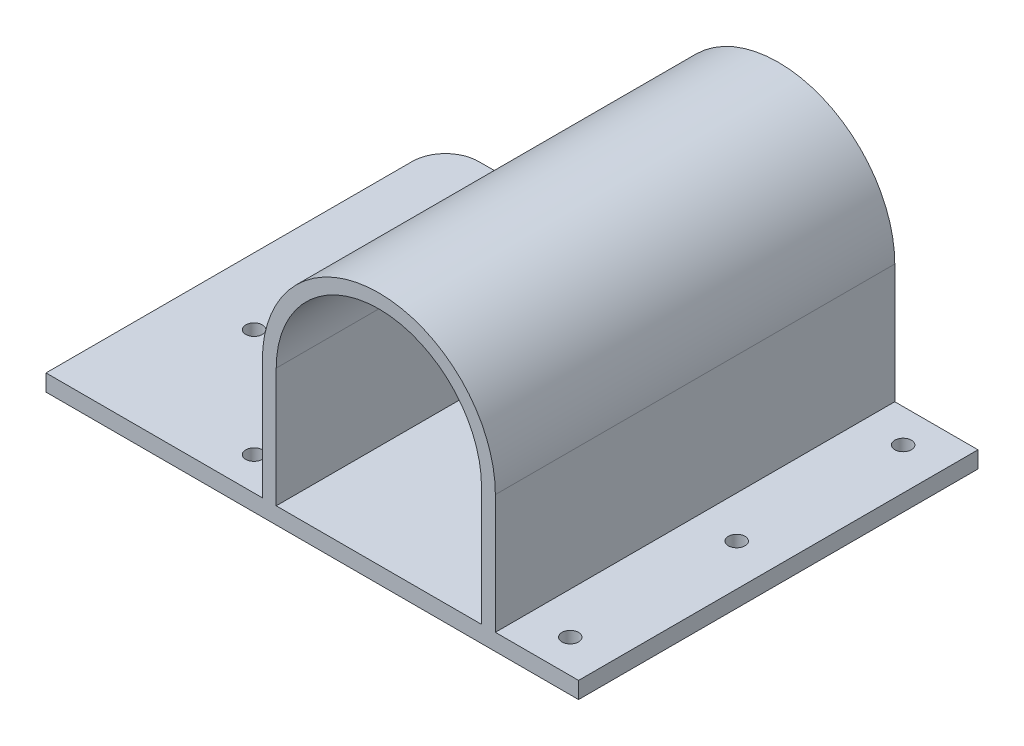
ISO-10303-21;
HEADER;
FILE_DESCRIPTION(('STEP AP214'),'2;1');
FILE_NAME('part.step','',(''),(''),'','','');
FILE_SCHEMA(('AUTOMOTIVE_DESIGN { 1 0 10303 214 1 1 1 1 }'));
ENDSEC;
DATA;
#1=APPLICATION_CONTEXT('core data for automotive mechanical design processes');
#2=APPLICATION_PROTOCOL_DEFINITION('international standard','automotive_design',2000,#1);
#3=PRODUCT_CONTEXT('',#1,'mechanical');
#4=PRODUCT('Part','Part','',(#3));
#5=PRODUCT_RELATED_PRODUCT_CATEGORY('part','',(#4));
#6=PRODUCT_DEFINITION_FORMATION('','',#4);
#7=PRODUCT_DEFINITION_CONTEXT('part definition',#1,'design');
#8=PRODUCT_DEFINITION('design','',#6,#7);
#9=PRODUCT_DEFINITION_SHAPE('','',#8);
#10=(LENGTH_UNIT() NAMED_UNIT(*) SI_UNIT(.MILLI.,.METRE.));
#11=(NAMED_UNIT(*) PLANE_ANGLE_UNIT() SI_UNIT($,.RADIAN.));
#12=(NAMED_UNIT(*) SI_UNIT($,.STERADIAN.) SOLID_ANGLE_UNIT());
#13=UNCERTAINTY_MEASURE_WITH_UNIT(LENGTH_MEASURE(1.E-05),#10,'distance_accuracy_value','');
#14=(GEOMETRIC_REPRESENTATION_CONTEXT(3) GLOBAL_UNCERTAINTY_ASSIGNED_CONTEXT((#13)) GLOBAL_UNIT_ASSIGNED_CONTEXT((#10,
#11,#12)) REPRESENTATION_CONTEXT('',''));
#15=CARTESIAN_POINT('',(0.,0.,0.));
#16=DIRECTION('',(0.,0.,1.));
#17=DIRECTION('',(1.,0.,0.));
#18=AXIS2_PLACEMENT_3D('',#15,#16,#17);
#19=CARTESIAN_POINT('',(0.,-15.5,72.));
#20=DIRECTION('',(0.,0.,-1.));
#21=DIRECTION('',(-1.,0.,0.));
#22=AXIS2_PLACEMENT_3D('',#19,#20,#21);
#23=CYLINDRICAL_SURFACE('',#22,1.65);
#24=CARTESIAN_POINT('',(0.,-15.5,0.));
#25=DIRECTION('',(0.,0.,1.));
#26=DIRECTION('',(1.,0.,0.));
#27=AXIS2_PLACEMENT_3D('',#24,#25,#26);
#28=CIRCLE('',#27,1.65);
#29=CARTESIAN_POINT('',(1.65000000000006,-15.5,0.));
#30=VERTEX_POINT('',#29);
#31=EDGE_CURVE('E262',#30,#30,#28,.T.);
#32=ORIENTED_EDGE('',*,*,#31,.F.);
#33=EDGE_LOOP('',(#32));
#34=FACE_BOUND('',#33,.T.);
#35=CARTESIAN_POINT('',(0.,-15.5,15.));
#36=DIRECTION('',(0.,0.,1.));
#37=DIRECTION('',(1.,0.,0.));
#38=AXIS2_PLACEMENT_3D('',#35,#36,#37);
#39=CIRCLE('',#38,1.65);
#40=CARTESIAN_POINT('',(1.65000000000006,-15.5,15.));
#41=VERTEX_POINT('',#40);
#42=EDGE_CURVE('E241',#41,#41,#39,.T.);
#43=ORIENTED_EDGE('',*,*,#42,.T.);
#44=EDGE_LOOP('',(#43));
#45=FACE_BOUND('',#44,.T.);
#46=ADVANCED_FACE('F39',(#34,#45),#23,.F.);
#47=CARTESIAN_POINT('',(-7.,0.,72.));
#48=DIRECTION('',(0.,0.,-1.));
#49=DIRECTION('',(-1.,0.,0.));
#50=AXIS2_PLACEMENT_3D('',#47,#48,#49);
#51=CYLINDRICAL_SURFACE('',#50,6.15);
#52=CARTESIAN_POINT('',(-7.,0.,0.));
#53=DIRECTION('',(0.,0.,1.));
#54=DIRECTION('',(1.,0.,0.));
#55=AXIS2_PLACEMENT_3D('',#52,#53,#54);
#56=CIRCLE('',#55,6.15);
#57=CARTESIAN_POINT('',(-0.85,0.,0.));
#58=VERTEX_POINT('',#57);
#59=EDGE_CURVE('E259',#58,#58,#56,.T.);
#60=ORIENTED_EDGE('',*,*,#59,.F.);
#61=EDGE_LOOP('',(#60));
#62=FACE_BOUND('',#61,.T.);
#63=CARTESIAN_POINT('',(-7.,0.,15.));
#64=DIRECTION('',(0.,0.,1.));
#65=DIRECTION('',(1.,0.,0.));
#66=AXIS2_PLACEMENT_3D('',#63,#64,#65);
#67=CIRCLE('',#66,6.15);
#68=CARTESIAN_POINT('',(-0.85,0.,15.));
#69=VERTEX_POINT('',#68);
#70=EDGE_CURVE('E238',#69,#69,#67,.T.);
#71=ORIENTED_EDGE('',*,*,#70,.T.);
#72=EDGE_LOOP('',(#71));
#73=FACE_BOUND('',#72,.T.);
#74=ADVANCED_FACE('F355',(#62,#73),#51,.F.);
#75=CARTESIAN_POINT('',(-13.4233937586588,-7.75000000000005,72.));
#76=DIRECTION('',(0.,0.,-1.));
#77=DIRECTION('',(-1.,0.,0.));
#78=AXIS2_PLACEMENT_3D('',#75,#76,#77);
#79=CYLINDRICAL_SURFACE('',#78,1.65);
#80=CARTESIAN_POINT('',(-13.4233937586588,-7.75000000000005,0.));
#81=DIRECTION('',(0.,0.,1.));
#82=DIRECTION('',(1.,0.,0.));
#83=AXIS2_PLACEMENT_3D('',#80,#81,#82);
#84=CIRCLE('',#83,1.65);
#85=CARTESIAN_POINT('',(-11.7733937586588,-7.75000000000005,0.));
#86=VERTEX_POINT('',#85);
#87=EDGE_CURVE('E256',#86,#86,#84,.T.);
#88=ORIENTED_EDGE('',*,*,#87,.F.);
#89=EDGE_LOOP('',(#88));
#90=FACE_BOUND('',#89,.T.);
#91=CARTESIAN_POINT('',(-13.4233937586588,-7.75000000000005,15.));
#92=DIRECTION('',(0.,0.,1.));
#93=DIRECTION('',(1.,0.,0.));
#94=AXIS2_PLACEMENT_3D('',#91,#92,#93);
#95=CIRCLE('',#94,1.65);
#96=CARTESIAN_POINT('',(-11.7733937586588,-7.75000000000005,15.));
#97=VERTEX_POINT('',#96);
#98=EDGE_CURVE('E235',#97,#97,#95,.T.);
#99=ORIENTED_EDGE('',*,*,#98,.T.);
#100=EDGE_LOOP('',(#99));
#101=FACE_BOUND('',#100,.T.);
#102=ADVANCED_FACE('F361',(#90,#101),#79,.F.);
#103=CARTESIAN_POINT('',(-13.4233937586588,7.74999999999994,72.));
#104=DIRECTION('',(0.,0.,-1.));
#105=DIRECTION('',(-1.,0.,0.));
#106=AXIS2_PLACEMENT_3D('',#103,#104,#105);
#107=CYLINDRICAL_SURFACE('',#106,1.65);
#108=CARTESIAN_POINT('',(-13.4233937586588,7.74999999999994,0.));
#109=DIRECTION('',(0.,0.,1.));
#110=DIRECTION('',(1.,0.,0.));
#111=AXIS2_PLACEMENT_3D('',#108,#109,#110);
#112=CIRCLE('',#111,1.65);
#113=CARTESIAN_POINT('',(-11.7733937586588,7.74999999999994,0.));
#114=VERTEX_POINT('',#113);
#115=EDGE_CURVE('E253',#114,#114,#112,.T.);
#116=ORIENTED_EDGE('',*,*,#115,.F.);
#117=EDGE_LOOP('',(#116));
#118=FACE_BOUND('',#117,.T.);
#119=CARTESIAN_POINT('',(-13.4233937586588,7.74999999999994,15.));
#120=DIRECTION('',(0.,0.,1.));
#121=DIRECTION('',(1.,0.,0.));
#122=AXIS2_PLACEMENT_3D('',#119,#120,#121);
#123=CIRCLE('',#122,1.65);
#124=CARTESIAN_POINT('',(-11.7733937586588,7.74999999999994,15.));
#125=VERTEX_POINT('',#124);
#126=EDGE_CURVE('E232',#125,#125,#123,.T.);
#127=ORIENTED_EDGE('',*,*,#126,.T.);
#128=EDGE_LOOP('',(#127));
#129=FACE_BOUND('',#128,.T.);
#130=ADVANCED_FACE('F401',(#118,#129),#107,.F.);
#131=CARTESIAN_POINT('',(0.,15.5,72.));
#132=DIRECTION('',(0.,0.,-1.));
#133=DIRECTION('',(-1.,0.,0.));
#134=AXIS2_PLACEMENT_3D('',#131,#132,#133);
#135=CYLINDRICAL_SURFACE('',#134,1.65);
#136=CARTESIAN_POINT('',(0.,15.5,0.));
#137=DIRECTION('',(0.,0.,1.));
#138=DIRECTION('',(1.,0.,0.));
#139=AXIS2_PLACEMENT_3D('',#136,#137,#138);
#140=CIRCLE('',#139,1.65);
#141=CARTESIAN_POINT('',(1.64999999999994,15.5,0.));
#142=VERTEX_POINT('',#141);
#143=EDGE_CURVE('E250',#142,#142,#140,.T.);
#144=ORIENTED_EDGE('',*,*,#143,.F.);
#145=EDGE_LOOP('',(#144));
#146=FACE_BOUND('',#145,.T.);
#147=CARTESIAN_POINT('',(0.,15.5,15.));
#148=DIRECTION('',(0.,0.,1.));
#149=DIRECTION('',(1.,0.,0.));
#150=AXIS2_PLACEMENT_3D('',#147,#148,#149);
#151=CIRCLE('',#150,1.65);
#152=CARTESIAN_POINT('',(1.64999999999994,15.5,15.));
#153=VERTEX_POINT('',#152);
#154=EDGE_CURVE('E229',#153,#153,#151,.T.);
#155=ORIENTED_EDGE('',*,*,#154,.T.);
#156=EDGE_LOOP('',(#155));
#157=FACE_BOUND('',#156,.T.);
#158=ADVANCED_FACE('F397',(#146,#157),#135,.F.);
#159=CARTESIAN_POINT('',(13.4233937586588,7.75000000000006,72.));
#160=DIRECTION('',(0.,0.,-1.));
#161=DIRECTION('',(-1.,0.,0.));
#162=AXIS2_PLACEMENT_3D('',#159,#160,#161);
#163=CYLINDRICAL_SURFACE('',#162,1.65);
#164=CARTESIAN_POINT('',(13.4233937586588,7.75000000000006,0.));
#165=DIRECTION('',(0.,0.,1.));
#166=DIRECTION('',(1.,0.,0.));
#167=AXIS2_PLACEMENT_3D('',#164,#165,#166);
#168=CIRCLE('',#167,1.65);
#169=CARTESIAN_POINT('',(15.0733937586588,7.75000000000006,0.));
#170=VERTEX_POINT('',#169);
#171=EDGE_CURVE('E247',#170,#170,#168,.T.);
#172=ORIENTED_EDGE('',*,*,#171,.F.);
#173=EDGE_LOOP('',(#172));
#174=FACE_BOUND('',#173,.T.);
#175=CARTESIAN_POINT('',(13.4233937586588,7.75000000000006,15.));
#176=DIRECTION('',(0.,0.,1.));
#177=DIRECTION('',(1.,0.,0.));
#178=AXIS2_PLACEMENT_3D('',#175,#176,#177);
#179=CIRCLE('',#178,1.65);
#180=CARTESIAN_POINT('',(15.0733937586588,7.75000000000006,15.));
#181=VERTEX_POINT('',#180);
#182=EDGE_CURVE('E226',#181,#181,#179,.T.);
#183=ORIENTED_EDGE('',*,*,#182,.T.);
#184=EDGE_LOOP('',(#183));
#185=FACE_BOUND('',#184,.T.);
#186=ADVANCED_FACE('F393',(#174,#185),#163,.F.);
#187=CARTESIAN_POINT('',(13.4233937586588,-7.74999999999995,72.));
#188=DIRECTION('',(0.,0.,-1.));
#189=DIRECTION('',(-1.,0.,0.));
#190=AXIS2_PLACEMENT_3D('',#187,#188,#189);
#191=CYLINDRICAL_SURFACE('',#190,1.65);
#192=CARTESIAN_POINT('',(13.4233937586588,-7.74999999999995,0.));
#193=DIRECTION('',(0.,0.,1.));
#194=DIRECTION('',(1.,0.,0.));
#195=AXIS2_PLACEMENT_3D('',#192,#193,#194);
#196=CIRCLE('',#195,1.65);
#197=CARTESIAN_POINT('',(15.0733937586588,-7.74999999999995,0.));
#198=VERTEX_POINT('',#197);
#199=EDGE_CURVE('E244',#198,#198,#196,.T.);
#200=ORIENTED_EDGE('',*,*,#199,.F.);
#201=EDGE_LOOP('',(#200));
#202=FACE_BOUND('',#201,.T.);
#203=CARTESIAN_POINT('',(13.4233937586588,-7.74999999999995,15.));
#204=DIRECTION('',(0.,0.,1.));
#205=DIRECTION('',(1.,0.,0.));
#206=AXIS2_PLACEMENT_3D('',#203,#204,#205);
#207=CIRCLE('',#206,1.65);
#208=CARTESIAN_POINT('',(15.0733937586588,-7.74999999999995,15.));
#209=VERTEX_POINT('',#208);
#210=EDGE_CURVE('E219',#209,#209,#207,.T.);
#211=ORIENTED_EDGE('',*,*,#210,.T.);
#212=EDGE_LOOP('',(#211));
#213=FACE_BOUND('',#212,.T.);
#214=ADVANCED_FACE('F370',(#202,#213),#191,.F.);
#215=CARTESIAN_POINT('',(0.,0.,72.));
#216=DIRECTION('',(0.,0.,1.));
#217=DIRECTION('',(1.,0.,0.));
#218=AXIS2_PLACEMENT_3D('',#215,#216,#217);
#219=PLANE('',#218);
#220=CARTESIAN_POINT('',(0.,0.,72.));
#221=DIRECTION('',(0.,0.,1.));
#222=DIRECTION('',(1.,0.,0.));
#223=AXIS2_PLACEMENT_3D('',#220,#221,#222);
#224=CIRCLE('',#223,18.5);
#225=CARTESIAN_POINT('',(18.5,0.,72.));
#226=VERTEX_POINT('',#225);
#227=CARTESIAN_POINT('',(-18.5,0.,72.));
#228=VERTEX_POINT('',#227);
#229=EDGE_CURVE('E191',#226,#228,#224,.T.);
#230=ORIENTED_EDGE('',*,*,#229,.F.);
#231=DIRECTION('',(0.,1.,0.));
#232=VECTOR('',#231,1.);
#233=CARTESIAN_POINT('',(18.5,-21.5,72.));
#234=LINE('',#233,#232);
#235=CARTESIAN_POINT('',(18.5,-21.5,72.));
#236=VERTEX_POINT('',#235);
#237=EDGE_CURVE('E198',#236,#226,#234,.T.);
#238=ORIENTED_EDGE('',*,*,#237,.F.);
#239=DIRECTION('',(1.,0.,0.));
#240=VECTOR('',#239,1.);
#241=CARTESIAN_POINT('',(-18.5,-21.5,72.));
#242=LINE('',#241,#240);
#243=CARTESIAN_POINT('',(-18.5,-21.5,72.));
#244=VERTEX_POINT('',#243);
#245=EDGE_CURVE('E212',#244,#236,#242,.T.);
#246=ORIENTED_EDGE('',*,*,#245,.F.);
#247=DIRECTION('',(0.,-1.,0.));
#248=VECTOR('',#247,1.);
#249=CARTESIAN_POINT('',(-18.5,0.,72.));
#250=LINE('',#249,#248);
#251=EDGE_CURVE('E209',#228,#244,#250,.T.);
#252=ORIENTED_EDGE('',*,*,#251,.F.);
#253=EDGE_LOOP('',(#230,#238,#246,#252));
#254=FACE_BOUND('',#253,.T.);
#255=CARTESIAN_POINT('',(0.,0.,72.));
#256=DIRECTION('',(0.,0.,1.));
#257=DIRECTION('',(1.,0.,0.));
#258=AXIS2_PLACEMENT_3D('',#255,#256,#257);
#259=CIRCLE('',#258,21.);
#260=CARTESIAN_POINT('',(21.,0.,72.));
#261=VERTEX_POINT('',#260);
#262=CARTESIAN_POINT('',(-21.,0.,72.));
#263=VERTEX_POINT('',#262);
#264=EDGE_CURVE('E266',#261,#263,#259,.T.);
#265=ORIENTED_EDGE('',*,*,#264,.T.);
#266=DIRECTION('',(0.,-1.,0.));
#267=VECTOR('',#266,1.);
#268=CARTESIAN_POINT('',(-21.,0.,72.));
#269=LINE('',#268,#267);
#270=CARTESIAN_POINT('',(-21.,-21.5,72.));
#271=VERTEX_POINT('',#270);
#272=EDGE_CURVE('E268',#263,#271,#269,.T.);
#273=ORIENTED_EDGE('',*,*,#272,.T.);
#274=DIRECTION('',(-1.,0.,0.));
#275=VECTOR('',#274,1.);
#276=CARTESIAN_POINT('',(-21.,-21.5,72.));
#277=LINE('',#276,#275);
#278=CARTESIAN_POINT('',(-60.,-21.5,72.));
#279=VERTEX_POINT('',#278);
#280=EDGE_CURVE('E148',#271,#279,#277,.T.);
#281=ORIENTED_EDGE('',*,*,#280,.T.);
#282=DIRECTION('',(0.,1.,0.));
#283=VECTOR('',#282,1.);
#284=CARTESIAN_POINT('',(-60.,-24.5,72.));
#285=LINE('',#284,#283);
#286=CARTESIAN_POINT('',(-60.,-24.5,72.));
#287=VERTEX_POINT('',#286);
#288=EDGE_CURVE('E134',#287,#279,#285,.T.);
#289=ORIENTED_EDGE('',*,*,#288,.F.);
#290=DIRECTION('',(1.,0.,0.));
#291=VECTOR('',#290,1.);
#292=CARTESIAN_POINT('',(-36.,-24.5,72.));
#293=LINE('',#292,#291);
#294=CARTESIAN_POINT('',(36.,-24.5,72.));
#295=VERTEX_POINT('',#294);
#296=EDGE_CURVE('E140',#287,#295,#293,.T.);
#297=ORIENTED_EDGE('',*,*,#296,.T.);
#298=DIRECTION('',(0.,1.,0.));
#299=VECTOR('',#298,1.);
#300=CARTESIAN_POINT('',(36.,-24.5,72.));
#301=LINE('',#300,#299);
#302=CARTESIAN_POINT('',(36.,-21.5,72.));
#303=VERTEX_POINT('',#302);
#304=EDGE_CURVE('E147',#295,#303,#301,.T.);
#305=ORIENTED_EDGE('',*,*,#304,.T.);
#306=DIRECTION('',(-1.,0.,0.));
#307=VECTOR('',#306,1.);
#308=CARTESIAN_POINT('',(36.,-21.5,72.));
#309=LINE('',#308,#307);
#310=CARTESIAN_POINT('',(21.,-21.5,72.));
#311=VERTEX_POINT('',#310);
#312=EDGE_CURVE('E273',#303,#311,#309,.T.);
#313=ORIENTED_EDGE('',*,*,#312,.T.);
#314=DIRECTION('',(0.,1.,0.));
#315=VECTOR('',#314,1.);
#316=CARTESIAN_POINT('',(21.,-21.5,72.));
#317=LINE('',#316,#315);
#318=EDGE_CURVE('E275',#311,#261,#317,.T.);
#319=ORIENTED_EDGE('',*,*,#318,.T.);
#320=EDGE_LOOP('',(#265,#273,#281,#289,#297,#305,#313,#319));
#321=FACE_BOUND('',#320,.T.);
#322=ADVANCED_FACE('F152',(#254,#321),#219,.T.);
#323=CARTESIAN_POINT('',(0.,0.,0.));
#324=DIRECTION('',(0.,0.,1.));
#325=DIRECTION('',(1.,0.,0.));
#326=AXIS2_PLACEMENT_3D('',#323,#324,#325);
#327=PLANE('',#326);
#328=DIRECTION('',(1.,0.,0.));
#329=VECTOR('',#328,1.);
#330=CARTESIAN_POINT('',(-36.,-24.5,0.));
#331=LINE('',#330,#329);
#332=CARTESIAN_POINT('',(-54.,-24.5,0.));
#333=VERTEX_POINT('',#332);
#334=CARTESIAN_POINT('',(36.,-24.5,0.));
#335=VERTEX_POINT('',#334);
#336=EDGE_CURVE('E284',#333,#335,#331,.T.);
#337=ORIENTED_EDGE('',*,*,#336,.F.);
#338=DIRECTION('',(0.,1.,0.));
#339=VECTOR('',#338,1.);
#340=CARTESIAN_POINT('',(-54.,-21.5,0.));
#341=LINE('',#340,#339);
#342=CARTESIAN_POINT('',(-54.,-21.5,0.));
#343=VERTEX_POINT('',#342);
#344=EDGE_CURVE('E306',#333,#343,#341,.T.);
#345=ORIENTED_EDGE('',*,*,#344,.T.);
#346=DIRECTION('',(-1.,0.,0.));
#347=VECTOR('',#346,1.);
#348=CARTESIAN_POINT('',(-21.,-21.5,0.));
#349=LINE('',#348,#347);
#350=CARTESIAN_POINT('',(-21.,-21.5,0.));
#351=VERTEX_POINT('',#350);
#352=EDGE_CURVE('E282',#351,#343,#349,.T.);
#353=ORIENTED_EDGE('',*,*,#352,.F.);
#354=DIRECTION('',(0.,-1.,0.));
#355=VECTOR('',#354,1.);
#356=CARTESIAN_POINT('',(-21.,0.,0.));
#357=LINE('',#356,#355);
#358=CARTESIAN_POINT('',(-21.,0.,0.));
#359=VERTEX_POINT('',#358);
#360=EDGE_CURVE('E280',#359,#351,#357,.T.);
#361=ORIENTED_EDGE('',*,*,#360,.F.);
#362=CARTESIAN_POINT('',(0.,0.,0.));
#363=DIRECTION('',(0.,0.,1.));
#364=DIRECTION('',(1.,0.,0.));
#365=AXIS2_PLACEMENT_3D('',#362,#363,#364);
#366=CIRCLE('',#365,21.);
#367=CARTESIAN_POINT('',(21.,0.,0.));
#368=VERTEX_POINT('',#367);
#369=EDGE_CURVE('E265',#368,#359,#366,.T.);
#370=ORIENTED_EDGE('',*,*,#369,.F.);
#371=DIRECTION('',(0.,1.,0.));
#372=VECTOR('',#371,1.);
#373=CARTESIAN_POINT('',(21.,-21.5,0.));
#374=LINE('',#373,#372);
#375=CARTESIAN_POINT('',(21.,-21.5,0.));
#376=VERTEX_POINT('',#375);
#377=EDGE_CURVE('E269',#376,#368,#374,.T.);
#378=ORIENTED_EDGE('',*,*,#377,.F.);
#379=DIRECTION('',(-1.,0.,0.));
#380=VECTOR('',#379,1.);
#381=CARTESIAN_POINT('',(36.,-21.5,0.));
#382=LINE('',#381,#380);
#383=CARTESIAN_POINT('',(36.,-21.5,0.));
#384=VERTEX_POINT('',#383);
#385=EDGE_CURVE('E288',#384,#376,#382,.T.);
#386=ORIENTED_EDGE('',*,*,#385,.F.);
#387=DIRECTION('',(0.,1.,0.));
#388=VECTOR('',#387,1.);
#389=CARTESIAN_POINT('',(36.,-24.5,0.));
#390=LINE('',#389,#388);
#391=EDGE_CURVE('E286',#335,#384,#390,.T.);
#392=ORIENTED_EDGE('',*,*,#391,.F.);
#393=EDGE_LOOP('',(#337,#345,#353,#361,#370,#378,#386,#392));
#394=FACE_BOUND('',#393,.T.);
#395=ORIENTED_EDGE('',*,*,#31,.T.);
#396=EDGE_LOOP('',(#395));
#397=FACE_BOUND('',#396,.T.);
#398=ORIENTED_EDGE('',*,*,#59,.T.);
#399=EDGE_LOOP('',(#398));
#400=FACE_BOUND('',#399,.T.);
#401=ORIENTED_EDGE('',*,*,#87,.T.);
#402=EDGE_LOOP('',(#401));
#403=FACE_BOUND('',#402,.T.);
#404=ORIENTED_EDGE('',*,*,#115,.T.);
#405=EDGE_LOOP('',(#404));
#406=FACE_BOUND('',#405,.T.);
#407=ORIENTED_EDGE('',*,*,#143,.T.);
#408=EDGE_LOOP('',(#407));
#409=FACE_BOUND('',#408,.T.);
#410=ORIENTED_EDGE('',*,*,#171,.T.);
#411=EDGE_LOOP('',(#410));
#412=FACE_BOUND('',#411,.T.);
#413=ORIENTED_EDGE('',*,*,#199,.T.);
#414=EDGE_LOOP('',(#413));
#415=FACE_BOUND('',#414,.T.);
#416=ADVANCED_FACE('F315',(#394,#397,#400,#403,#406,#409,#412,#415),#327,.F.);
#417=CARTESIAN_POINT('',(0.,0.,72.));
#418=DIRECTION('',(0.,0.,-1.));
#419=DIRECTION('',(-1.,0.,0.));
#420=AXIS2_PLACEMENT_3D('',#417,#418,#419);
#421=CYLINDRICAL_SURFACE('',#420,21.);
#422=ORIENTED_EDGE('',*,*,#369,.T.);
#423=DIRECTION('',(0.,0.,-1.));
#424=VECTOR('',#423,1.);
#425=CARTESIAN_POINT('',(-21.,0.,72.));
#426=LINE('',#425,#424);
#427=EDGE_CURVE('E303',#263,#359,#426,.T.);
#428=ORIENTED_EDGE('',*,*,#427,.F.);
#429=ORIENTED_EDGE('',*,*,#264,.F.);
#430=DIRECTION('',(0.,0.,-1.));
#431=VECTOR('',#430,1.);
#432=CARTESIAN_POINT('',(21.,0.,72.));
#433=LINE('',#432,#431);
#434=EDGE_CURVE('E277',#261,#368,#433,.T.);
#435=ORIENTED_EDGE('',*,*,#434,.T.);
#436=EDGE_LOOP('',(#422,#428,#429,#435));
#437=FACE_BOUND('',#436,.T.);
#438=ADVANCED_FACE('F329',(#437),#421,.T.);
#439=CARTESIAN_POINT('',(-21.,0.,72.));
#440=DIRECTION('',(1.,0.,0.));
#441=DIRECTION('',(0.,1.,0.));
#442=AXIS2_PLACEMENT_3D('',#439,#440,#441);
#443=PLANE('',#442);
#444=ORIENTED_EDGE('',*,*,#360,.T.);
#445=DIRECTION('',(0.,0.,-1.));
#446=VECTOR('',#445,1.);
#447=CARTESIAN_POINT('',(-21.,-21.5,72.));
#448=LINE('',#447,#446);
#449=EDGE_CURVE('E300',#271,#351,#448,.T.);
#450=ORIENTED_EDGE('',*,*,#449,.F.);
#451=ORIENTED_EDGE('',*,*,#272,.F.);
#452=ORIENTED_EDGE('',*,*,#427,.T.);
#453=EDGE_LOOP('',(#444,#450,#451,#452));
#454=FACE_BOUND('',#453,.T.);
#455=ADVANCED_FACE('F323',(#454),#443,.F.);
#456=CARTESIAN_POINT('',(-21.,-21.5,72.));
#457=DIRECTION('',(0.,-1.,0.));
#458=DIRECTION('',(0.,0.,-1.));
#459=AXIS2_PLACEMENT_3D('',#456,#457,#458);
#460=PLANE('',#459);
#461=CARTESIAN_POINT('',(-28.5,-21.5,6.));
#462=DIRECTION('',(0.,1.,0.));
#463=DIRECTION('',(0.,0.,1.));
#464=AXIS2_PLACEMENT_3D('',#461,#462,#463);
#465=CIRCLE('',#464,1.5);
#466=CARTESIAN_POINT('',(-28.5,-21.5,7.5));
#467=VERTEX_POINT('',#466);
#468=EDGE_CURVE('E164',#467,#467,#465,.T.);
#469=ORIENTED_EDGE('',*,*,#468,.F.);
#470=EDGE_LOOP('',(#469));
#471=FACE_BOUND('',#470,.T.);
#472=CARTESIAN_POINT('',(-28.5,-21.5,66.));
#473=DIRECTION('',(0.,1.,0.));
#474=DIRECTION('',(0.,0.,1.));
#475=AXIS2_PLACEMENT_3D('',#472,#473,#474);
#476=CIRCLE('',#475,1.5);
#477=CARTESIAN_POINT('',(-28.5,-21.5,67.5));
#478=VERTEX_POINT('',#477);
#479=EDGE_CURVE('E171',#478,#478,#476,.T.);
#480=ORIENTED_EDGE('',*,*,#479,.F.);
#481=EDGE_LOOP('',(#480));
#482=FACE_BOUND('',#481,.T.);
#483=CARTESIAN_POINT('',(-28.5,-21.5,36.));
#484=DIRECTION('',(0.,1.,0.));
#485=DIRECTION('',(0.,0.,1.));
#486=AXIS2_PLACEMENT_3D('',#483,#484,#485);
#487=CIRCLE('',#486,1.5);
#488=CARTESIAN_POINT('',(-28.5,-21.5,37.5));
#489=VERTEX_POINT('',#488);
#490=EDGE_CURVE('E167',#489,#489,#487,.T.);
#491=ORIENTED_EDGE('',*,*,#490,.F.);
#492=EDGE_LOOP('',(#491));
#493=FACE_BOUND('',#492,.T.);
#494=ORIENTED_EDGE('',*,*,#352,.T.);
#495=CARTESIAN_POINT('',(-54.,-21.5,6.));
#496=DIRECTION('',(0.,-1.,0.));
#497=DIRECTION('',(0.,0.,-1.));
#498=AXIS2_PLACEMENT_3D('',#495,#496,#497);
#499=CIRCLE('',#498,6.);
#500=CARTESIAN_POINT('',(-60.,-21.5,6.00000000000001));
#501=VERTEX_POINT('',#500);
#502=EDGE_CURVE('E61',#343,#501,#499,.F.);
#503=ORIENTED_EDGE('',*,*,#502,.T.);
#504=DIRECTION('',(0.,0.,1.));
#505=VECTOR('',#504,1.);
#506=CARTESIAN_POINT('',(-60.,-21.5,72.));
#507=LINE('',#506,#505);
#508=EDGE_CURVE('E137',#501,#279,#507,.T.);
#509=ORIENTED_EDGE('',*,*,#508,.T.);
#510=ORIENTED_EDGE('',*,*,#280,.F.);
#511=ORIENTED_EDGE('',*,*,#449,.T.);
#512=EDGE_LOOP('',(#494,#503,#509,#510,#511));
#513=FACE_BOUND('',#512,.T.);
#514=CARTESIAN_POINT('',(-48.,-21.5,10.5));
#515=DIRECTION('',(0.,1.,0.));
#516=DIRECTION('',(0.,0.,1.));
#517=AXIS2_PLACEMENT_3D('',#514,#515,#516);
#518=CIRCLE('',#517,1.5);
#519=CARTESIAN_POINT('',(-48.,-21.5,12.));
#520=VERTEX_POINT('',#519);
#521=EDGE_CURVE('E483',#520,#520,#518,.T.);
#522=ORIENTED_EDGE('',*,*,#521,.F.);
#523=EDGE_LOOP('',(#522));
#524=FACE_BOUND('',#523,.T.);
#525=CARTESIAN_POINT('',(-48.,-21.5,46.5));
#526=DIRECTION('',(0.,1.,0.));
#527=DIRECTION('',(0.,0.,1.));
#528=AXIS2_PLACEMENT_3D('',#525,#526,#527);
#529=CIRCLE('',#528,1.5);
#530=CARTESIAN_POINT('',(-48.,-21.5,48.));
#531=VERTEX_POINT('',#530);
#532=EDGE_CURVE('E485',#531,#531,#529,.T.);
#533=ORIENTED_EDGE('',*,*,#532,.F.);
#534=EDGE_LOOP('',(#533));
#535=FACE_BOUND('',#534,.T.);
#536=ADVANCED_FACE('F319',(#471,#482,#493,#513,#524,#535),#460,.F.);
#537=CARTESIAN_POINT('',(-36.,-24.5,72.));
#538=DIRECTION('',(0.,1.,0.));
#539=DIRECTION('',(0.,0.,1.));
#540=AXIS2_PLACEMENT_3D('',#537,#538,#539);
#541=PLANE('',#540);
#542=CARTESIAN_POINT('',(-28.5,-24.5,6.));
#543=DIRECTION('',(0.,1.,0.));
#544=DIRECTION('',(0.,0.,1.));
#545=AXIS2_PLACEMENT_3D('',#542,#543,#544);
#546=CIRCLE('',#545,1.5);
#547=CARTESIAN_POINT('',(-28.5,-24.5,7.5));
#548=VERTEX_POINT('',#547);
#549=EDGE_CURVE('E168',#548,#548,#546,.T.);
#550=ORIENTED_EDGE('',*,*,#549,.T.);
#551=EDGE_LOOP('',(#550));
#552=FACE_BOUND('',#551,.T.);
#553=CARTESIAN_POINT('',(-28.5,-24.5,66.));
#554=DIRECTION('',(0.,1.,0.));
#555=DIRECTION('',(0.,0.,1.));
#556=AXIS2_PLACEMENT_3D('',#553,#554,#555);
#557=CIRCLE('',#556,1.5);
#558=CARTESIAN_POINT('',(-28.5,-24.5,67.5));
#559=VERTEX_POINT('',#558);
#560=EDGE_CURVE('E174',#559,#559,#557,.T.);
#561=ORIENTED_EDGE('',*,*,#560,.T.);
#562=EDGE_LOOP('',(#561));
#563=FACE_BOUND('',#562,.T.);
#564=CARTESIAN_POINT('',(28.5,-24.5,66.));
#565=DIRECTION('',(0.,1.,0.));
#566=DIRECTION('',(0.,0.,-1.));
#567=AXIS2_PLACEMENT_3D('',#564,#565,#566);
#568=CIRCLE('',#567,1.5);
#569=CARTESIAN_POINT('',(28.5,-24.5,64.5));
#570=VERTEX_POINT('',#569);
#571=EDGE_CURVE('E180',#570,#570,#568,.T.);
#572=ORIENTED_EDGE('',*,*,#571,.T.);
#573=EDGE_LOOP('',(#572));
#574=FACE_BOUND('',#573,.T.);
#575=CARTESIAN_POINT('',(28.5,-24.5,5.99999999999999));
#576=DIRECTION('',(0.,1.,0.));
#577=DIRECTION('',(0.,0.,-1.));
#578=AXIS2_PLACEMENT_3D('',#575,#576,#577);
#579=CIRCLE('',#578,1.5);
#580=CARTESIAN_POINT('',(28.5,-24.5,4.49999999999999));
#581=VERTEX_POINT('',#580);
#582=EDGE_CURVE('E162',#581,#581,#579,.T.);
#583=ORIENTED_EDGE('',*,*,#582,.T.);
#584=EDGE_LOOP('',(#583));
#585=FACE_BOUND('',#584,.T.);
#586=CARTESIAN_POINT('',(28.5,-24.5,36.));
#587=DIRECTION('',(0.,1.,0.));
#588=DIRECTION('',(0.,0.,-1.));
#589=AXIS2_PLACEMENT_3D('',#586,#587,#588);
#590=CIRCLE('',#589,1.5);
#591=CARTESIAN_POINT('',(28.5,-24.5,34.5));
#592=VERTEX_POINT('',#591);
#593=EDGE_CURVE('E154',#592,#592,#590,.T.);
#594=ORIENTED_EDGE('',*,*,#593,.T.);
#595=EDGE_LOOP('',(#594));
#596=FACE_BOUND('',#595,.T.);
#597=CARTESIAN_POINT('',(-28.5,-24.5,36.));
#598=DIRECTION('',(0.,1.,0.));
#599=DIRECTION('',(0.,0.,1.));
#600=AXIS2_PLACEMENT_3D('',#597,#598,#599);
#601=CIRCLE('',#600,1.5);
#602=CARTESIAN_POINT('',(-28.5,-24.5,37.5));
#603=VERTEX_POINT('',#602);
#604=EDGE_CURVE('E188',#603,#603,#601,.T.);
#605=ORIENTED_EDGE('',*,*,#604,.T.);
#606=EDGE_LOOP('',(#605));
#607=FACE_BOUND('',#606,.T.);
#608=DIRECTION('',(0.,0.,1.));
#609=VECTOR('',#608,1.);
#610=CARTESIAN_POINT('',(-60.,-24.5,72.));
#611=LINE('',#610,#609);
#612=CARTESIAN_POINT('',(-60.,-24.5,6.00000000000001));
#613=VERTEX_POINT('',#612);
#614=EDGE_CURVE('E130',#613,#287,#611,.T.);
#615=ORIENTED_EDGE('',*,*,#614,.F.);
#616=CARTESIAN_POINT('',(-54.,-24.5,6.));
#617=DIRECTION('',(0.,1.,0.));
#618=DIRECTION('',(0.,0.,1.));
#619=AXIS2_PLACEMENT_3D('',#616,#617,#618);
#620=CIRCLE('',#619,6.);
#621=EDGE_CURVE('E11',#613,#333,#620,.F.);
#622=ORIENTED_EDGE('',*,*,#621,.T.);
#623=ORIENTED_EDGE('',*,*,#336,.T.);
#624=DIRECTION('',(0.,0.,-1.));
#625=VECTOR('',#624,1.);
#626=CARTESIAN_POINT('',(36.,-24.5,72.));
#627=LINE('',#626,#625);
#628=EDGE_CURVE('E144',#295,#335,#627,.T.);
#629=ORIENTED_EDGE('',*,*,#628,.F.);
#630=ORIENTED_EDGE('',*,*,#296,.F.);
#631=EDGE_LOOP('',(#615,#622,#623,#629,#630));
#632=FACE_BOUND('',#631,.T.);
#633=CARTESIAN_POINT('',(-48.,-24.5,10.5));
#634=DIRECTION('',(0.,1.,0.));
#635=DIRECTION('',(0.,0.,1.));
#636=AXIS2_PLACEMENT_3D('',#633,#634,#635);
#637=CIRCLE('',#636,1.5);
#638=CARTESIAN_POINT('',(-48.,-24.5,12.));
#639=VERTEX_POINT('',#638);
#640=EDGE_CURVE('E480',#639,#639,#637,.T.);
#641=ORIENTED_EDGE('',*,*,#640,.T.);
#642=EDGE_LOOP('',(#641));
#643=FACE_BOUND('',#642,.T.);
#644=CARTESIAN_POINT('',(-48.,-24.5,46.5));
#645=DIRECTION('',(0.,1.,0.));
#646=DIRECTION('',(0.,0.,1.));
#647=AXIS2_PLACEMENT_3D('',#644,#645,#646);
#648=CIRCLE('',#647,1.5);
#649=CARTESIAN_POINT('',(-48.,-24.5,48.));
#650=VERTEX_POINT('',#649);
#651=EDGE_CURVE('E488',#650,#650,#648,.T.);
#652=ORIENTED_EDGE('',*,*,#651,.T.);
#653=EDGE_LOOP('',(#652));
#654=FACE_BOUND('',#653,.T.);
#655=ADVANCED_FACE('F141',(#552,#563,#574,#585,#596,#607,#632,#643,#654),#541,.F.);
#656=CARTESIAN_POINT('',(36.,-24.5,72.));
#657=DIRECTION('',(-1.,0.,0.));
#658=DIRECTION('',(0.,0.,1.));
#659=AXIS2_PLACEMENT_3D('',#656,#657,#658);
#660=PLANE('',#659);
#661=ORIENTED_EDGE('',*,*,#391,.T.);
#662=DIRECTION('',(0.,0.,-1.));
#663=VECTOR('',#662,1.);
#664=CARTESIAN_POINT('',(36.,-21.5,72.));
#665=LINE('',#664,#663);
#666=EDGE_CURVE('E296',#303,#384,#665,.T.);
#667=ORIENTED_EDGE('',*,*,#666,.F.);
#668=ORIENTED_EDGE('',*,*,#304,.F.);
#669=ORIENTED_EDGE('',*,*,#628,.T.);
#670=EDGE_LOOP('',(#661,#667,#668,#669));
#671=FACE_BOUND('',#670,.T.);
#672=ADVANCED_FACE('F341',(#671),#660,.F.);
#673=CARTESIAN_POINT('',(36.,-21.5,72.));
#674=DIRECTION('',(0.,-1.,0.));
#675=DIRECTION('',(0.,0.,-1.));
#676=AXIS2_PLACEMENT_3D('',#673,#674,#675);
#677=PLANE('',#676);
#678=CARTESIAN_POINT('',(28.5,-21.5,66.));
#679=DIRECTION('',(0.,1.,0.));
#680=DIRECTION('',(0.,0.,-1.));
#681=AXIS2_PLACEMENT_3D('',#678,#679,#680);
#682=CIRCLE('',#681,1.5);
#683=CARTESIAN_POINT('',(28.5,-21.5,64.5));
#684=VERTEX_POINT('',#683);
#685=EDGE_CURVE('E177',#684,#684,#682,.T.);
#686=ORIENTED_EDGE('',*,*,#685,.F.);
#687=EDGE_LOOP('',(#686));
#688=FACE_BOUND('',#687,.T.);
#689=CARTESIAN_POINT('',(28.5,-21.5,5.99999999999999));
#690=DIRECTION('',(0.,1.,0.));
#691=DIRECTION('',(0.,0.,-1.));
#692=AXIS2_PLACEMENT_3D('',#689,#690,#691);
#693=CIRCLE('',#692,1.5);
#694=CARTESIAN_POINT('',(28.5,-21.5,4.49999999999999));
#695=VERTEX_POINT('',#694);
#696=EDGE_CURVE('E183',#695,#695,#693,.T.);
#697=ORIENTED_EDGE('',*,*,#696,.F.);
#698=EDGE_LOOP('',(#697));
#699=FACE_BOUND('',#698,.T.);
#700=CARTESIAN_POINT('',(28.5,-21.5,36.));
#701=DIRECTION('',(0.,1.,0.));
#702=DIRECTION('',(0.,0.,-1.));
#703=AXIS2_PLACEMENT_3D('',#700,#701,#702);
#704=CIRCLE('',#703,1.5);
#705=CARTESIAN_POINT('',(28.5,-21.5,34.5));
#706=VERTEX_POINT('',#705);
#707=EDGE_CURVE('E157',#706,#706,#704,.T.);
#708=ORIENTED_EDGE('',*,*,#707,.F.);
#709=EDGE_LOOP('',(#708));
#710=FACE_BOUND('',#709,.T.);
#711=ORIENTED_EDGE('',*,*,#385,.T.);
#712=DIRECTION('',(0.,0.,-1.));
#713=VECTOR('',#712,1.);
#714=CARTESIAN_POINT('',(21.,-21.5,72.));
#715=LINE('',#714,#713);
#716=EDGE_CURVE('E293',#311,#376,#715,.T.);
#717=ORIENTED_EDGE('',*,*,#716,.F.);
#718=ORIENTED_EDGE('',*,*,#312,.F.);
#719=ORIENTED_EDGE('',*,*,#666,.T.);
#720=EDGE_LOOP('',(#711,#717,#718,#719));
#721=FACE_BOUND('',#720,.T.);
#722=ADVANCED_FACE('F338',(#688,#699,#710,#721),#677,.F.);
#723=CARTESIAN_POINT('',(21.,-21.5,72.));
#724=DIRECTION('',(-1.,0.,0.));
#725=DIRECTION('',(0.,-1.,0.));
#726=AXIS2_PLACEMENT_3D('',#723,#724,#725);
#727=PLANE('',#726);
#728=ORIENTED_EDGE('',*,*,#377,.T.);
#729=ORIENTED_EDGE('',*,*,#434,.F.);
#730=ORIENTED_EDGE('',*,*,#318,.F.);
#731=ORIENTED_EDGE('',*,*,#716,.T.);
#732=EDGE_LOOP('',(#728,#729,#730,#731));
#733=FACE_BOUND('',#732,.T.);
#734=ADVANCED_FACE('F334',(#733),#727,.F.);
#735=CARTESIAN_POINT('',(0.,0.,15.));
#736=DIRECTION('',(0.,0.,1.));
#737=DIRECTION('',(1.,0.,0.));
#738=AXIS2_PLACEMENT_3D('',#735,#736,#737);
#739=CYLINDRICAL_SURFACE('',#738,18.5);
#740=ORIENTED_EDGE('',*,*,#229,.T.);
#741=DIRECTION('',(0.,0.,1.));
#742=VECTOR('',#741,1.);
#743=CARTESIAN_POINT('',(-18.5,0.,15.));
#744=LINE('',#743,#742);
#745=CARTESIAN_POINT('',(-18.5,0.,15.));
#746=VERTEX_POINT('',#745);
#747=EDGE_CURVE('E207',#746,#228,#744,.T.);
#748=ORIENTED_EDGE('',*,*,#747,.F.);
#749=CARTESIAN_POINT('',(0.,0.,15.));
#750=DIRECTION('',(0.,0.,1.));
#751=DIRECTION('',(1.,0.,0.));
#752=AXIS2_PLACEMENT_3D('',#749,#750,#751);
#753=CIRCLE('',#752,18.5);
#754=CARTESIAN_POINT('',(18.5,0.,15.));
#755=VERTEX_POINT('',#754);
#756=EDGE_CURVE('E194',#755,#746,#753,.T.);
#757=ORIENTED_EDGE('',*,*,#756,.F.);
#758=DIRECTION('',(0.,0.,1.));
#759=VECTOR('',#758,1.);
#760=CARTESIAN_POINT('',(18.5,0.,15.));
#761=LINE('',#760,#759);
#762=EDGE_CURVE('E217',#755,#226,#761,.T.);
#763=ORIENTED_EDGE('',*,*,#762,.T.);
#764=EDGE_LOOP('',(#740,#748,#757,#763));
#765=FACE_BOUND('',#764,.T.);
#766=ADVANCED_FACE('F374',(#765),#739,.F.);
#767=CARTESIAN_POINT('',(18.5,-21.5,15.));
#768=DIRECTION('',(1.,0.,0.));
#769=DIRECTION('',(0.,1.,0.));
#770=AXIS2_PLACEMENT_3D('',#767,#768,#769);
#771=PLANE('',#770);
#772=ORIENTED_EDGE('',*,*,#237,.T.);
#773=ORIENTED_EDGE('',*,*,#762,.F.);
#774=DIRECTION('',(0.,1.,0.));
#775=VECTOR('',#774,1.);
#776=CARTESIAN_POINT('',(18.5,-21.5,15.));
#777=LINE('',#776,#775);
#778=CARTESIAN_POINT('',(18.5,-21.5,15.));
#779=VERTEX_POINT('',#778);
#780=EDGE_CURVE('E204',#779,#755,#777,.T.);
#781=ORIENTED_EDGE('',*,*,#780,.F.);
#782=DIRECTION('',(0.,0.,1.));
#783=VECTOR('',#782,1.);
#784=CARTESIAN_POINT('',(18.5,-21.5,15.));
#785=LINE('',#784,#783);
#786=EDGE_CURVE('E220',#779,#236,#785,.T.);
#787=ORIENTED_EDGE('',*,*,#786,.T.);
#788=EDGE_LOOP('',(#772,#773,#781,#787));
#789=FACE_BOUND('',#788,.T.);
#790=ADVANCED_FACE('F378',(#789),#771,.F.);
#791=CARTESIAN_POINT('',(-18.5,-21.5,15.));
#792=DIRECTION('',(0.,-1.,0.));
#793=DIRECTION('',(0.,0.,-1.));
#794=AXIS2_PLACEMENT_3D('',#791,#792,#793);
#795=PLANE('',#794);
#796=ORIENTED_EDGE('',*,*,#245,.T.);
#797=ORIENTED_EDGE('',*,*,#786,.F.);
#798=DIRECTION('',(1.,0.,0.));
#799=VECTOR('',#798,1.);
#800=CARTESIAN_POINT('',(-18.5,-21.5,15.));
#801=LINE('',#800,#799);
#802=CARTESIAN_POINT('',(-18.5,-21.5,15.));
#803=VERTEX_POINT('',#802);
#804=EDGE_CURVE('E201',#803,#779,#801,.T.);
#805=ORIENTED_EDGE('',*,*,#804,.F.);
#806=DIRECTION('',(0.,0.,1.));
#807=VECTOR('',#806,1.);
#808=CARTESIAN_POINT('',(-18.5,-21.5,15.));
#809=LINE('',#808,#807);
#810=EDGE_CURVE('E222',#803,#244,#809,.T.);
#811=ORIENTED_EDGE('',*,*,#810,.T.);
#812=EDGE_LOOP('',(#796,#797,#805,#811));
#813=FACE_BOUND('',#812,.T.);
#814=ADVANCED_FACE('F385',(#813),#795,.F.);
#815=CARTESIAN_POINT('',(-18.5,0.,15.));
#816=DIRECTION('',(-1.,0.,0.));
#817=DIRECTION('',(0.,-1.,0.));
#818=AXIS2_PLACEMENT_3D('',#815,#816,#817);
#819=PLANE('',#818);
#820=ORIENTED_EDGE('',*,*,#251,.T.);
#821=ORIENTED_EDGE('',*,*,#810,.F.);
#822=DIRECTION('',(0.,-1.,0.));
#823=VECTOR('',#822,1.);
#824=CARTESIAN_POINT('',(-18.5,0.,15.));
#825=LINE('',#824,#823);
#826=EDGE_CURVE('E197',#746,#803,#825,.T.);
#827=ORIENTED_EDGE('',*,*,#826,.F.);
#828=ORIENTED_EDGE('',*,*,#747,.T.);
#829=EDGE_LOOP('',(#820,#821,#827,#828));
#830=FACE_BOUND('',#829,.T.);
#831=ADVANCED_FACE('F390',(#830),#819,.F.);
#832=CARTESIAN_POINT('',(0.,0.,15.));
#833=DIRECTION('',(0.,0.,1.));
#834=DIRECTION('',(1.,0.,0.));
#835=AXIS2_PLACEMENT_3D('',#832,#833,#834);
#836=PLANE('',#835);
#837=ORIENTED_EDGE('',*,*,#42,.F.);
#838=EDGE_LOOP('',(#837));
#839=FACE_BOUND('',#838,.T.);
#840=ORIENTED_EDGE('',*,*,#70,.F.);
#841=EDGE_LOOP('',(#840));
#842=FACE_BOUND('',#841,.T.);
#843=ORIENTED_EDGE('',*,*,#98,.F.);
#844=EDGE_LOOP('',(#843));
#845=FACE_BOUND('',#844,.T.);
#846=ORIENTED_EDGE('',*,*,#126,.F.);
#847=EDGE_LOOP('',(#846));
#848=FACE_BOUND('',#847,.T.);
#849=ORIENTED_EDGE('',*,*,#154,.F.);
#850=EDGE_LOOP('',(#849));
#851=FACE_BOUND('',#850,.T.);
#852=ORIENTED_EDGE('',*,*,#182,.F.);
#853=EDGE_LOOP('',(#852));
#854=FACE_BOUND('',#853,.T.);
#855=ORIENTED_EDGE('',*,*,#210,.F.);
#856=EDGE_LOOP('',(#855));
#857=FACE_BOUND('',#856,.T.);
#858=ORIENTED_EDGE('',*,*,#756,.T.);
#859=ORIENTED_EDGE('',*,*,#826,.T.);
#860=ORIENTED_EDGE('',*,*,#804,.T.);
#861=ORIENTED_EDGE('',*,*,#780,.T.);
#862=EDGE_LOOP('',(#858,#859,#860,#861));
#863=FACE_BOUND('',#862,.T.);
#864=ADVANCED_FACE('F413',(#839,#842,#845,#848,#851,#854,#857,#863),#836,.T.);
#865=CARTESIAN_POINT('',(28.5,-24.5,36.));
#866=DIRECTION('',(0.,1.,0.));
#867=DIRECTION('',(0.,0.,1.));
#868=AXIS2_PLACEMENT_3D('',#865,#866,#867);
#869=CYLINDRICAL_SURFACE('',#868,1.5);
#870=ORIENTED_EDGE('',*,*,#593,.F.);
#871=EDGE_LOOP('',(#870));
#872=FACE_BOUND('',#871,.T.);
#873=ORIENTED_EDGE('',*,*,#707,.T.);
#874=EDGE_LOOP('',(#873));
#875=FACE_BOUND('',#874,.T.);
#876=ADVANCED_FACE('F416',(#872,#875),#869,.F.);
#877=CARTESIAN_POINT('',(28.5,-24.5,5.99999999999999));
#878=DIRECTION('',(0.,1.,0.));
#879=DIRECTION('',(0.,0.,1.));
#880=AXIS2_PLACEMENT_3D('',#877,#878,#879);
#881=CYLINDRICAL_SURFACE('',#880,1.5);
#882=ORIENTED_EDGE('',*,*,#582,.F.);
#883=EDGE_LOOP('',(#882));
#884=FACE_BOUND('',#883,.T.);
#885=ORIENTED_EDGE('',*,*,#696,.T.);
#886=EDGE_LOOP('',(#885));
#887=FACE_BOUND('',#886,.T.);
#888=ADVANCED_FACE('F448',(#884,#887),#881,.F.);
#889=CARTESIAN_POINT('',(28.5,-24.5,66.));
#890=DIRECTION('',(0.,1.,0.));
#891=DIRECTION('',(0.,0.,1.));
#892=AXIS2_PLACEMENT_3D('',#889,#890,#891);
#893=CYLINDRICAL_SURFACE('',#892,1.5);
#894=ORIENTED_EDGE('',*,*,#571,.F.);
#895=EDGE_LOOP('',(#894));
#896=FACE_BOUND('',#895,.T.);
#897=ORIENTED_EDGE('',*,*,#685,.T.);
#898=EDGE_LOOP('',(#897));
#899=FACE_BOUND('',#898,.T.);
#900=ADVANCED_FACE('F446',(#896,#899),#893,.F.);
#901=CARTESIAN_POINT('',(-28.5,-24.5,36.));
#902=DIRECTION('',(0.,1.,0.));
#903=DIRECTION('',(0.,0.,1.));
#904=AXIS2_PLACEMENT_3D('',#901,#902,#903);
#905=CYLINDRICAL_SURFACE('',#904,1.5);
#906=ORIENTED_EDGE('',*,*,#604,.F.);
#907=EDGE_LOOP('',(#906));
#908=FACE_BOUND('',#907,.T.);
#909=ORIENTED_EDGE('',*,*,#490,.T.);
#910=EDGE_LOOP('',(#909));
#911=FACE_BOUND('',#910,.T.);
#912=ADVANCED_FACE('F442',(#908,#911),#905,.F.);
#913=CARTESIAN_POINT('',(-28.5,-24.5,66.));
#914=DIRECTION('',(0.,1.,0.));
#915=DIRECTION('',(0.,0.,1.));
#916=AXIS2_PLACEMENT_3D('',#913,#914,#915);
#917=CYLINDRICAL_SURFACE('',#916,1.5);
#918=ORIENTED_EDGE('',*,*,#560,.F.);
#919=EDGE_LOOP('',(#918));
#920=FACE_BOUND('',#919,.T.);
#921=ORIENTED_EDGE('',*,*,#479,.T.);
#922=EDGE_LOOP('',(#921));
#923=FACE_BOUND('',#922,.T.);
#924=ADVANCED_FACE('F445',(#920,#923),#917,.F.);
#925=CARTESIAN_POINT('',(-28.5,-24.5,6.));
#926=DIRECTION('',(0.,1.,0.));
#927=DIRECTION('',(0.,0.,1.));
#928=AXIS2_PLACEMENT_3D('',#925,#926,#927);
#929=CYLINDRICAL_SURFACE('',#928,1.5);
#930=ORIENTED_EDGE('',*,*,#549,.F.);
#931=EDGE_LOOP('',(#930));
#932=FACE_BOUND('',#931,.T.);
#933=ORIENTED_EDGE('',*,*,#468,.T.);
#934=EDGE_LOOP('',(#933));
#935=FACE_BOUND('',#934,.T.);
#936=ADVANCED_FACE('F457',(#932,#935),#929,.F.);
#937=CARTESIAN_POINT('',(-60.,-24.5,72.));
#938=DIRECTION('',(-1.,0.,0.));
#939=DIRECTION('',(0.,0.,1.));
#940=AXIS2_PLACEMENT_3D('',#937,#938,#939);
#941=PLANE('',#940);
#942=ORIENTED_EDGE('',*,*,#508,.F.);
#943=DIRECTION('',(0.,1.,0.));
#944=VECTOR('',#943,1.);
#945=CARTESIAN_POINT('',(-60.,-24.5,6.));
#946=LINE('',#945,#944);
#947=EDGE_CURVE('E47',#501,#613,#946,.F.);
#948=ORIENTED_EDGE('',*,*,#947,.T.);
#949=ORIENTED_EDGE('',*,*,#614,.T.);
#950=ORIENTED_EDGE('',*,*,#288,.T.);
#951=EDGE_LOOP('',(#942,#948,#949,#950));
#952=FACE_BOUND('',#951,.T.);
#953=ADVANCED_FACE('F132',(#952),#941,.T.);
#954=CARTESIAN_POINT('',(-48.,-24.5,46.5));
#955=DIRECTION('',(0.,1.,0.));
#956=DIRECTION('',(0.,0.,1.));
#957=AXIS2_PLACEMENT_3D('',#954,#955,#956);
#958=CYLINDRICAL_SURFACE('',#957,1.5);
#959=ORIENTED_EDGE('',*,*,#651,.F.);
#960=EDGE_LOOP('',(#959));
#961=FACE_BOUND('',#960,.T.);
#962=ORIENTED_EDGE('',*,*,#532,.T.);
#963=EDGE_LOOP('',(#962));
#964=FACE_BOUND('',#963,.T.);
#965=ADVANCED_FACE('F467',(#961,#964),#958,.F.);
#966=CARTESIAN_POINT('',(-48.,-24.5,10.5));
#967=DIRECTION('',(0.,1.,0.));
#968=DIRECTION('',(0.,0.,1.));
#969=AXIS2_PLACEMENT_3D('',#966,#967,#968);
#970=CYLINDRICAL_SURFACE('',#969,1.5);
#971=ORIENTED_EDGE('',*,*,#640,.F.);
#972=EDGE_LOOP('',(#971));
#973=FACE_BOUND('',#972,.T.);
#974=ORIENTED_EDGE('',*,*,#521,.T.);
#975=EDGE_LOOP('',(#974));
#976=FACE_BOUND('',#975,.T.);
#977=ADVANCED_FACE('F470',(#973,#976),#970,.F.);
#978=CARTESIAN_POINT('',(-54.,0.,6.));
#979=DIRECTION('',(0.,-1.,0.));
#980=DIRECTION('',(0.,0.,-1.));
#981=AXIS2_PLACEMENT_3D('',#978,#979,#980);
#982=CYLINDRICAL_SURFACE('',#981,6.);
#983=ORIENTED_EDGE('',*,*,#621,.F.);
#984=ORIENTED_EDGE('',*,*,#947,.F.);
#985=ORIENTED_EDGE('',*,*,#502,.F.);
#986=ORIENTED_EDGE('',*,*,#344,.F.);
#987=EDGE_LOOP('',(#983,#984,#985,#986));
#988=FACE_BOUND('',#987,.T.);
#989=ADVANCED_FACE('F41',(#988),#982,.T.);
#990=CLOSED_SHELL('',(#46,#74,#102,#130,#158,#186,#214,#322,#416,#438,#455,#536,#655,#672,#722,
#734,#766,#790,#814,#831,#864,#876,#888,#900,#912,#924,#936,#953,#965,#977,#989));
#991=MANIFOLD_SOLID_BREP('B2',#990);
#992=ADVANCED_BREP_SHAPE_REPRESENTATION('',(#18,#991),#14);
#993=SHAPE_DEFINITION_REPRESENTATION(#9,#992);
ENDSEC;
END-ISO-10303-21;
